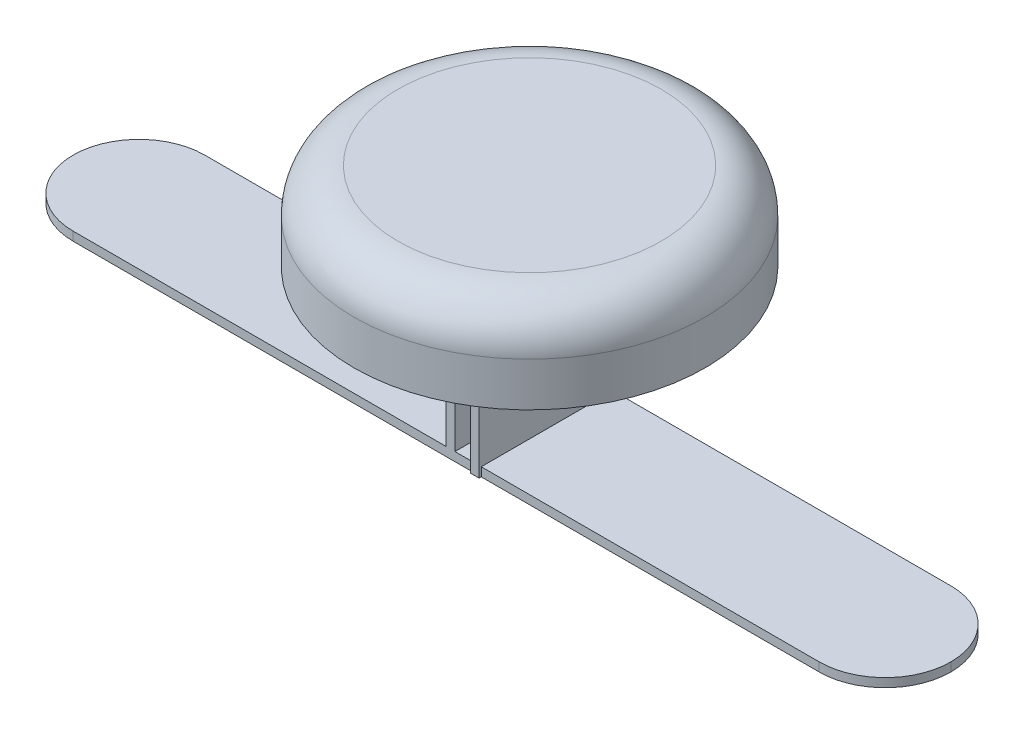
ISO-10303-21;
HEADER;
FILE_DESCRIPTION(('STEP AP214'),'2;1');
FILE_NAME('part.step','',(''),(''),'','','');
FILE_SCHEMA(('AUTOMOTIVE_DESIGN { 1 0 10303 214 1 1 1 1 }'));
ENDSEC;
DATA;
#1=APPLICATION_CONTEXT('core data for automotive mechanical design processes');
#2=APPLICATION_PROTOCOL_DEFINITION('international standard','automotive_design',2000,#1);
#3=PRODUCT_CONTEXT('',#1,'mechanical');
#4=PRODUCT('Part','Part','',(#3));
#5=PRODUCT_RELATED_PRODUCT_CATEGORY('part','',(#4));
#6=PRODUCT_DEFINITION_FORMATION('','',#4);
#7=PRODUCT_DEFINITION_CONTEXT('part definition',#1,'design');
#8=PRODUCT_DEFINITION('design','',#6,#7);
#9=PRODUCT_DEFINITION_SHAPE('','',#8);
#10=(LENGTH_UNIT() NAMED_UNIT(*) SI_UNIT(.MILLI.,.METRE.));
#11=(NAMED_UNIT(*) PLANE_ANGLE_UNIT() SI_UNIT($,.RADIAN.));
#12=(NAMED_UNIT(*) SI_UNIT($,.STERADIAN.) SOLID_ANGLE_UNIT());
#13=UNCERTAINTY_MEASURE_WITH_UNIT(LENGTH_MEASURE(1.E-05),#10,'distance_accuracy_value','');
#14=(GEOMETRIC_REPRESENTATION_CONTEXT(3) GLOBAL_UNCERTAINTY_ASSIGNED_CONTEXT((#13)) GLOBAL_UNIT_ASSIGNED_CONTEXT((#10,
#11,#12)) REPRESENTATION_CONTEXT('',''));
#15=CARTESIAN_POINT('',(0.,0.,0.));
#16=DIRECTION('',(0.,0.,1.));
#17=DIRECTION('',(1.,0.,0.));
#18=AXIS2_PLACEMENT_3D('',#15,#16,#17);
#19=CARTESIAN_POINT('',(0.,0.,0.));
#20=DIRECTION('',(0.,1.,0.));
#21=DIRECTION('',(0.,0.,1.));
#22=AXIS2_PLACEMENT_3D('',#19,#20,#21);
#23=PLANE('',#22);
#24=DIRECTION('',(0.,0.,-1.));
#25=VECTOR('',#24,1.);
#26=CARTESIAN_POINT('',(-0.4,0.,1.5));
#27=LINE('',#26,#25);
#28=CARTESIAN_POINT('',(-0.4,0.,1.5));
#29=VERTEX_POINT('',#28);
#30=CARTESIAN_POINT('',(-0.4,0.,-1.5));
#31=VERTEX_POINT('',#30);
#32=EDGE_CURVE('E217',#29,#31,#27,.T.);
#33=ORIENTED_EDGE('',*,*,#32,.F.);
#34=DIRECTION('',(-1.,0.,0.));
#35=VECTOR('',#34,1.);
#36=CARTESIAN_POINT('',(-0.4,0.,1.5));
#37=LINE('',#36,#35);
#38=CARTESIAN_POINT('',(-0.2,0.,1.5));
#39=VERTEX_POINT('',#38);
#40=EDGE_CURVE('E222',#39,#29,#37,.T.);
#41=ORIENTED_EDGE('',*,*,#40,.F.);
#42=DIRECTION('',(0.,0.,1.));
#43=VECTOR('',#42,1.);
#44=CARTESIAN_POINT('',(-0.2,0.,1.5));
#45=LINE('',#44,#43);
#46=CARTESIAN_POINT('',(-0.2,0.,-1.5));
#47=VERTEX_POINT('',#46);
#48=EDGE_CURVE('E231',#47,#39,#45,.T.);
#49=ORIENTED_EDGE('',*,*,#48,.F.);
#50=DIRECTION('',(1.,0.,0.));
#51=VECTOR('',#50,1.);
#52=CARTESIAN_POINT('',(-0.4,0.,-1.5));
#53=LINE('',#52,#51);
#54=EDGE_CURVE('E228',#31,#47,#53,.T.);
#55=ORIENTED_EDGE('',*,*,#54,.F.);
#56=EDGE_LOOP('',(#33,#41,#49,#55));
#57=FACE_BOUND('',#56,.T.);
#58=CARTESIAN_POINT('',(0.,0.,0.));
#59=DIRECTION('',(0.,1.,0.));
#60=DIRECTION('',(0.,0.,1.));
#61=AXIS2_PLACEMENT_3D('',#58,#59,#60);
#62=CIRCLE('',#61,4.);
#63=CARTESIAN_POINT('',(0.,0.,4.));
#64=VERTEX_POINT('',#63);
#65=EDGE_CURVE('E243',#64,#64,#62,.T.);
#66=ORIENTED_EDGE('',*,*,#65,.F.);
#67=EDGE_LOOP('',(#66));
#68=FACE_BOUND('',#67,.T.);
#69=DIRECTION('',(0.,0.,-1.));
#70=VECTOR('',#69,1.);
#71=CARTESIAN_POINT('',(0.2,0.,1.55));
#72=LINE('',#71,#70);
#73=CARTESIAN_POINT('',(0.2,0.,1.55));
#74=VERTEX_POINT('',#73);
#75=CARTESIAN_POINT('',(0.2,0.,-1.45));
#76=VERTEX_POINT('',#75);
#77=EDGE_CURVE('E189',#74,#76,#72,.T.);
#78=ORIENTED_EDGE('',*,*,#77,.F.);
#79=DIRECTION('',(-1.,0.,0.));
#80=VECTOR('',#79,1.);
#81=CARTESIAN_POINT('',(0.2,0.,1.55));
#82=LINE('',#81,#80);
#83=CARTESIAN_POINT('',(0.4,0.,1.55));
#84=VERTEX_POINT('',#83);
#85=EDGE_CURVE('E193',#84,#74,#82,.T.);
#86=ORIENTED_EDGE('',*,*,#85,.F.);
#87=DIRECTION('',(0.,0.,1.));
#88=VECTOR('',#87,1.);
#89=CARTESIAN_POINT('',(0.4,0.,1.55));
#90=LINE('',#89,#88);
#91=CARTESIAN_POINT('',(0.4,0.,-1.45));
#92=VERTEX_POINT('',#91);
#93=EDGE_CURVE('E203',#92,#84,#90,.T.);
#94=ORIENTED_EDGE('',*,*,#93,.F.);
#95=DIRECTION('',(1.,0.,0.));
#96=VECTOR('',#95,1.);
#97=CARTESIAN_POINT('',(0.2,0.,-1.45));
#98=LINE('',#97,#96);
#99=EDGE_CURVE('E200',#76,#92,#98,.T.);
#100=ORIENTED_EDGE('',*,*,#99,.F.);
#101=EDGE_LOOP('',(#78,#86,#94,#100));
#102=FACE_BOUND('',#101,.T.);
#103=ADVANCED_FACE('F33',(#57,#68,#102),#23,.F.);
#104=CARTESIAN_POINT('',(0.,2.,0.));
#105=DIRECTION('',(0.,-1.,0.));
#106=DIRECTION('',(0.,0.,-1.));
#107=AXIS2_PLACEMENT_3D('',#104,#105,#106);
#108=CYLINDRICAL_SURFACE('',#107,4.);
#109=CARTESIAN_POINT('',(0.,1.,0.));
#110=DIRECTION('',(0.,1.,0.));
#111=DIRECTION('',(0.,0.,1.));
#112=AXIS2_PLACEMENT_3D('',#109,#110,#111);
#113=CIRCLE('',#112,4.);
#114=CARTESIAN_POINT('',(0.,1.,4.));
#115=VERTEX_POINT('',#114);
#116=EDGE_CURVE('E165',#115,#115,#113,.F.);
#117=ORIENTED_EDGE('',*,*,#116,.T.);
#118=EDGE_LOOP('',(#117));
#119=FACE_BOUND('',#118,.T.);
#120=ORIENTED_EDGE('',*,*,#65,.T.);
#121=EDGE_LOOP('',(#120));
#122=FACE_BOUND('',#121,.T.);
#123=ADVANCED_FACE('F339',(#119,#122),#108,.T.);
#124=CARTESIAN_POINT('',(0.,2.,0.));
#125=DIRECTION('',(0.,1.,0.));
#126=DIRECTION('',(0.,0.,1.));
#127=AXIS2_PLACEMENT_3D('',#124,#125,#126);
#128=PLANE('',#127);
#129=CARTESIAN_POINT('',(0.,2.,0.));
#130=DIRECTION('',(0.,1.,0.));
#131=DIRECTION('',(0.,0.,1.));
#132=AXIS2_PLACEMENT_3D('',#129,#130,#131);
#133=CIRCLE('',#132,3.);
#134=CARTESIAN_POINT('',(0.,2.,3.));
#135=VERTEX_POINT('',#134);
#136=EDGE_CURVE('E246',#135,#135,#133,.T.);
#137=ORIENTED_EDGE('',*,*,#136,.T.);
#138=EDGE_LOOP('',(#137));
#139=FACE_BOUND('',#138,.T.);
#140=ADVANCED_FACE('F344',(#139),#128,.T.);
#141=CARTESIAN_POINT('',(0.,1.,0.));
#142=DIRECTION('',(0.,1.,0.));
#143=DIRECTION('',(0.,0.,1.));
#144=AXIS2_PLACEMENT_3D('',#141,#142,#143);
#145=TOROIDAL_SURFACE('',#144,3.,1.);
#146=ORIENTED_EDGE('',*,*,#116,.F.);
#147=EDGE_LOOP('',(#146));
#148=FACE_BOUND('',#147,.T.);
#149=ORIENTED_EDGE('',*,*,#136,.F.);
#150=EDGE_LOOP('',(#149));
#151=FACE_BOUND('',#150,.T.);
#152=ADVANCED_FACE('F350',(#148,#151),#145,.T.);
#153=CARTESIAN_POINT('',(-0.4,-3.2,1.5));
#154=DIRECTION('',(1.,0.,0.));
#155=DIRECTION('',(0.,0.,-1.));
#156=AXIS2_PLACEMENT_3D('',#153,#154,#155);
#157=PLANE('',#156);
#158=DIRECTION('',(0.,1.,0.));
#159=VECTOR('',#158,1.);
#160=CARTESIAN_POINT('',(-0.4,-3.2,-1.5));
#161=LINE('',#160,#159);
#162=CARTESIAN_POINT('',(-0.399999999999999,-3.,-1.5));
#163=VERTEX_POINT('',#162);
#164=EDGE_CURVE('E241',#163,#31,#161,.T.);
#165=ORIENTED_EDGE('',*,*,#164,.F.);
#166=DIRECTION('',(0.,0.,1.));
#167=VECTOR('',#166,1.);
#168=CARTESIAN_POINT('',(-0.4,-3.,1.5));
#169=LINE('',#168,#167);
#170=CARTESIAN_POINT('',(-0.4,-3.,1.5));
#171=VERTEX_POINT('',#170);
#172=EDGE_CURVE('E186',#163,#171,#169,.T.);
#173=ORIENTED_EDGE('',*,*,#172,.T.);
#174=DIRECTION('',(0.,1.,0.));
#175=VECTOR('',#174,1.);
#176=CARTESIAN_POINT('',(-0.4,-3.2,1.5));
#177=LINE('',#176,#175);
#178=EDGE_CURVE('E225',#171,#29,#177,.T.);
#179=ORIENTED_EDGE('',*,*,#178,.T.);
#180=ORIENTED_EDGE('',*,*,#32,.T.);
#181=EDGE_LOOP('',(#165,#173,#179,#180));
#182=FACE_BOUND('',#181,.T.);
#183=ADVANCED_FACE('F305',(#182),#157,.F.);
#184=CARTESIAN_POINT('',(-0.4,-3.2,-1.5));
#185=DIRECTION('',(0.,0.,1.));
#186=DIRECTION('',(1.,0.,0.));
#187=AXIS2_PLACEMENT_3D('',#184,#185,#186);
#188=PLANE('',#187);
#189=DIRECTION('',(1.,0.,0.));
#190=VECTOR('',#189,1.);
#191=CARTESIAN_POINT('',(-0.4,-3.2,-1.5));
#192=LINE('',#191,#190);
#193=CARTESIAN_POINT('',(-8.9,-3.2,-1.5));
#194=VERTEX_POINT('',#193);
#195=CARTESIAN_POINT('',(8.1,-3.2,-1.5));
#196=VERTEX_POINT('',#195);
#197=EDGE_CURVE('E218',#194,#196,#192,.T.);
#198=ORIENTED_EDGE('',*,*,#197,.F.);
#199=DIRECTION('',(0.,-1.,0.));
#200=VECTOR('',#199,1.);
#201=CARTESIAN_POINT('',(-8.9,-3.2,-1.5));
#202=LINE('',#201,#200);
#203=CARTESIAN_POINT('',(-8.9,-3.,-1.5));
#204=VERTEX_POINT('',#203);
#205=EDGE_CURVE('E267',#194,#204,#202,.F.);
#206=ORIENTED_EDGE('',*,*,#205,.T.);
#207=DIRECTION('',(-1.,0.,0.));
#208=VECTOR('',#207,1.);
#209=CARTESIAN_POINT('',(9.6,-3.,-1.5));
#210=LINE('',#209,#208);
#211=EDGE_CURVE('E153',#163,#204,#210,.T.);
#212=ORIENTED_EDGE('',*,*,#211,.F.);
#213=ORIENTED_EDGE('',*,*,#164,.T.);
#214=ORIENTED_EDGE('',*,*,#54,.T.);
#215=DIRECTION('',(0.,1.,0.));
#216=VECTOR('',#215,1.);
#217=CARTESIAN_POINT('',(-0.2,-3.2,-1.5));
#218=LINE('',#217,#216);
#219=CARTESIAN_POINT('',(-0.2,-3.,-1.5));
#220=VERTEX_POINT('',#219);
#221=EDGE_CURVE('E239',#220,#47,#218,.T.);
#222=ORIENTED_EDGE('',*,*,#221,.F.);
#223=CARTESIAN_POINT('',(8.1,-3.,-1.5));
#224=VERTEX_POINT('',#223);
#225=EDGE_CURVE('E175',#224,#220,#210,.T.);
#226=ORIENTED_EDGE('',*,*,#225,.F.);
#227=DIRECTION('',(0.,-1.,0.));
#228=VECTOR('',#227,1.);
#229=CARTESIAN_POINT('',(8.1,-3.2,-1.5));
#230=LINE('',#229,#228);
#231=EDGE_CURVE('E265',#224,#196,#230,.T.);
#232=ORIENTED_EDGE('',*,*,#231,.T.);
#233=EDGE_LOOP('',(#198,#206,#212,#213,#214,#222,#226,#232));
#234=FACE_BOUND('',#233,.T.);
#235=ADVANCED_FACE('F286',(#234),#188,.F.);
#236=CARTESIAN_POINT('',(-0.2,-3.2,1.5));
#237=DIRECTION('',(-1.,0.,0.));
#238=DIRECTION('',(0.,0.,1.));
#239=AXIS2_PLACEMENT_3D('',#236,#237,#238);
#240=PLANE('',#239);
#241=DIRECTION('',(0.,1.,0.));
#242=VECTOR('',#241,1.);
#243=CARTESIAN_POINT('',(-0.2,-3.2,1.5));
#244=LINE('',#243,#242);
#245=CARTESIAN_POINT('',(-0.200000000000001,-3.,1.5));
#246=VERTEX_POINT('',#245);
#247=EDGE_CURVE('E237',#246,#39,#244,.T.);
#248=ORIENTED_EDGE('',*,*,#247,.F.);
#249=DIRECTION('',(0.,0.,-1.));
#250=VECTOR('',#249,1.);
#251=CARTESIAN_POINT('',(-0.2,-3.,1.5));
#252=LINE('',#251,#250);
#253=EDGE_CURVE('E183',#246,#220,#252,.T.);
#254=ORIENTED_EDGE('',*,*,#253,.T.);
#255=ORIENTED_EDGE('',*,*,#221,.T.);
#256=ORIENTED_EDGE('',*,*,#48,.T.);
#257=EDGE_LOOP('',(#248,#254,#255,#256));
#258=FACE_BOUND('',#257,.T.);
#259=ADVANCED_FACE('F312',(#258),#240,.F.);
#260=CARTESIAN_POINT('',(-0.4,-3.2,1.5));
#261=DIRECTION('',(0.,0.,-1.));
#262=DIRECTION('',(-1.,0.,0.));
#263=AXIS2_PLACEMENT_3D('',#260,#261,#262);
#264=PLANE('',#263);
#265=DIRECTION('',(-1.,0.,0.));
#266=VECTOR('',#265,1.);
#267=CARTESIAN_POINT('',(9.6,-3.,1.5));
#268=LINE('',#267,#266);
#269=CARTESIAN_POINT('',(-8.9,-3.,1.5));
#270=VERTEX_POINT('',#269);
#271=EDGE_CURVE('E156',#171,#270,#268,.T.);
#272=ORIENTED_EDGE('',*,*,#271,.T.);
#273=DIRECTION('',(0.,1.,0.));
#274=VECTOR('',#273,1.);
#275=CARTESIAN_POINT('',(-8.9,-3.2,1.5));
#276=LINE('',#275,#274);
#277=CARTESIAN_POINT('',(-8.9,-3.2,1.5));
#278=VERTEX_POINT('',#277);
#279=EDGE_CURVE('E254',#270,#278,#276,.F.);
#280=ORIENTED_EDGE('',*,*,#279,.T.);
#281=DIRECTION('',(-1.,0.,0.));
#282=VECTOR('',#281,1.);
#283=CARTESIAN_POINT('',(-0.4,-3.2,1.5));
#284=LINE('',#283,#282);
#285=CARTESIAN_POINT('',(0.200000000000001,-3.2,1.5));
#286=VERTEX_POINT('',#285);
#287=EDGE_CURVE('E221',#286,#278,#284,.T.);
#288=ORIENTED_EDGE('',*,*,#287,.F.);
#289=DIRECTION('',(0.,-1.,0.));
#290=VECTOR('',#289,1.);
#291=CARTESIAN_POINT('',(0.2,-3.2,1.5));
#292=LINE('',#291,#290);
#293=CARTESIAN_POINT('',(0.200000000000001,-3.,1.5));
#294=VERTEX_POINT('',#293);
#295=EDGE_CURVE('E170',#294,#286,#292,.T.);
#296=ORIENTED_EDGE('',*,*,#295,.F.);
#297=EDGE_CURVE('E154',#294,#246,#268,.T.);
#298=ORIENTED_EDGE('',*,*,#297,.T.);
#299=ORIENTED_EDGE('',*,*,#247,.T.);
#300=ORIENTED_EDGE('',*,*,#40,.T.);
#301=ORIENTED_EDGE('',*,*,#178,.F.);
#302=EDGE_LOOP('',(#272,#280,#288,#296,#298,#299,#300,#301));
#303=FACE_BOUND('',#302,.T.);
#304=ADVANCED_FACE('F301',(#303),#264,.F.);
#305=CARTESIAN_POINT('',(0.,-3.2,0.));
#306=DIRECTION('',(0.,-1.,0.));
#307=DIRECTION('',(0.,0.,-1.));
#308=AXIS2_PLACEMENT_3D('',#305,#306,#307);
#309=PLANE('',#308);
#310=ORIENTED_EDGE('',*,*,#287,.T.);
#311=CARTESIAN_POINT('',(-8.9,-3.2,0.));
#312=DIRECTION('',(0.,-1.,0.));
#313=DIRECTION('',(0.,0.,-1.));
#314=AXIS2_PLACEMENT_3D('',#311,#312,#313);
#315=CIRCLE('',#314,1.5);
#316=CARTESIAN_POINT('',(-10.4,-3.2,0.));
#317=VERTEX_POINT('',#316);
#318=EDGE_CURVE('E263',#278,#317,#315,.T.);
#319=ORIENTED_EDGE('',*,*,#318,.T.);
#320=CARTESIAN_POINT('',(-8.9,-3.2,0.));
#321=DIRECTION('',(0.,-1.,0.));
#322=DIRECTION('',(0.,0.,-1.));
#323=AXIS2_PLACEMENT_3D('',#320,#321,#322);
#324=CIRCLE('',#323,1.5);
#325=EDGE_CURVE('E261',#317,#194,#324,.T.);
#326=ORIENTED_EDGE('',*,*,#325,.T.);
#327=ORIENTED_EDGE('',*,*,#197,.T.);
#328=CARTESIAN_POINT('',(8.1,-3.2,0.));
#329=DIRECTION('',(0.,-1.,0.));
#330=DIRECTION('',(0.,0.,-1.));
#331=AXIS2_PLACEMENT_3D('',#328,#329,#330);
#332=CIRCLE('',#331,1.5);
#333=CARTESIAN_POINT('',(9.6,-3.2,0.));
#334=VERTEX_POINT('',#333);
#335=EDGE_CURVE('E257',#196,#334,#332,.T.);
#336=ORIENTED_EDGE('',*,*,#335,.T.);
#337=CARTESIAN_POINT('',(8.1,-3.2,0.));
#338=DIRECTION('',(0.,-1.,0.));
#339=DIRECTION('',(0.,0.,-1.));
#340=AXIS2_PLACEMENT_3D('',#337,#338,#339);
#341=CIRCLE('',#340,1.5);
#342=CARTESIAN_POINT('',(8.1,-3.2,1.5));
#343=VERTEX_POINT('',#342);
#344=EDGE_CURVE('E259',#334,#343,#341,.T.);
#345=ORIENTED_EDGE('',*,*,#344,.T.);
#346=DIRECTION('',(-1.,0.,0.));
#347=VECTOR('',#346,1.);
#348=CARTESIAN_POINT('',(9.6,-3.2,1.5));
#349=LINE('',#348,#347);
#350=CARTESIAN_POINT('',(0.400000000000001,-3.2,1.5));
#351=VERTEX_POINT('',#350);
#352=EDGE_CURVE('E171',#343,#351,#349,.T.);
#353=ORIENTED_EDGE('',*,*,#352,.T.);
#354=DIRECTION('',(0.,0.,1.));
#355=VECTOR('',#354,1.);
#356=CARTESIAN_POINT('',(0.4,-3.2,1.55));
#357=LINE('',#356,#355);
#358=CARTESIAN_POINT('',(0.4,-3.2,1.55));
#359=VERTEX_POINT('',#358);
#360=EDGE_CURVE('E169',#351,#359,#357,.T.);
#361=ORIENTED_EDGE('',*,*,#360,.T.);
#362=DIRECTION('',(-1.,0.,0.));
#363=VECTOR('',#362,1.);
#364=CARTESIAN_POINT('',(0.2,-3.2,1.55));
#365=LINE('',#364,#363);
#366=CARTESIAN_POINT('',(0.2,-3.2,1.55));
#367=VERTEX_POINT('',#366);
#368=EDGE_CURVE('E195',#359,#367,#365,.T.);
#369=ORIENTED_EDGE('',*,*,#368,.T.);
#370=DIRECTION('',(0.,0.,-1.));
#371=VECTOR('',#370,1.);
#372=CARTESIAN_POINT('',(0.2,-3.2,1.55));
#373=LINE('',#372,#371);
#374=EDGE_CURVE('E190',#367,#286,#373,.T.);
#375=ORIENTED_EDGE('',*,*,#374,.T.);
#376=EDGE_LOOP('',(#310,#319,#326,#327,#336,#345,#353,#361,#369,#375));
#377=FACE_BOUND('',#376,.T.);
#378=ADVANCED_FACE('F320',(#377),#309,.T.);
#379=CARTESIAN_POINT('',(0.2,-3.2,1.55));
#380=DIRECTION('',(1.,0.,0.));
#381=DIRECTION('',(0.,0.,-1.));
#382=AXIS2_PLACEMENT_3D('',#379,#380,#381);
#383=PLANE('',#382);
#384=DIRECTION('',(0.,0.,1.));
#385=VECTOR('',#384,1.);
#386=CARTESIAN_POINT('',(0.2,-3.,1.55));
#387=LINE('',#386,#385);
#388=CARTESIAN_POINT('',(0.2,-3.,-1.45));
#389=VERTEX_POINT('',#388);
#390=EDGE_CURVE('E180',#389,#294,#387,.T.);
#391=ORIENTED_EDGE('',*,*,#390,.T.);
#392=ORIENTED_EDGE('',*,*,#295,.T.);
#393=ORIENTED_EDGE('',*,*,#374,.F.);
#394=DIRECTION('',(0.,1.,0.));
#395=VECTOR('',#394,1.);
#396=CARTESIAN_POINT('',(0.2,-3.2,1.55));
#397=LINE('',#396,#395);
#398=EDGE_CURVE('E197',#367,#74,#397,.T.);
#399=ORIENTED_EDGE('',*,*,#398,.T.);
#400=ORIENTED_EDGE('',*,*,#77,.T.);
#401=DIRECTION('',(0.,1.,0.));
#402=VECTOR('',#401,1.);
#403=CARTESIAN_POINT('',(0.2,-3.2,-1.45));
#404=LINE('',#403,#402);
#405=EDGE_CURVE('E215',#389,#76,#404,.T.);
#406=ORIENTED_EDGE('',*,*,#405,.F.);
#407=EDGE_LOOP('',(#391,#392,#393,#399,#400,#406));
#408=FACE_BOUND('',#407,.T.);
#409=ADVANCED_FACE('F317',(#408),#383,.F.);
#410=CARTESIAN_POINT('',(0.2,-3.2,-1.45));
#411=DIRECTION('',(0.,0.,1.));
#412=DIRECTION('',(1.,0.,0.));
#413=AXIS2_PLACEMENT_3D('',#410,#411,#412);
#414=PLANE('',#413);
#415=DIRECTION('',(0.,1.,0.));
#416=VECTOR('',#415,1.);
#417=CARTESIAN_POINT('',(0.4,-3.2,-1.45));
#418=LINE('',#417,#416);
#419=CARTESIAN_POINT('',(0.4,-3.,-1.45));
#420=VERTEX_POINT('',#419);
#421=EDGE_CURVE('E213',#420,#92,#418,.T.);
#422=ORIENTED_EDGE('',*,*,#421,.F.);
#423=DIRECTION('',(-1.,0.,0.));
#424=VECTOR('',#423,1.);
#425=CARTESIAN_POINT('',(0.2,-3.,-1.45));
#426=LINE('',#425,#424);
#427=EDGE_CURVE('E161',#420,#389,#426,.T.);
#428=ORIENTED_EDGE('',*,*,#427,.T.);
#429=ORIENTED_EDGE('',*,*,#405,.T.);
#430=ORIENTED_EDGE('',*,*,#99,.T.);
#431=EDGE_LOOP('',(#422,#428,#429,#430));
#432=FACE_BOUND('',#431,.T.);
#433=ADVANCED_FACE('F329',(#432),#414,.F.);
#434=CARTESIAN_POINT('',(0.4,-3.2,1.55));
#435=DIRECTION('',(-1.,0.,0.));
#436=DIRECTION('',(0.,0.,1.));
#437=AXIS2_PLACEMENT_3D('',#434,#435,#436);
#438=PLANE('',#437);
#439=ORIENTED_EDGE('',*,*,#360,.F.);
#440=DIRECTION('',(0.,1.,0.));
#441=VECTOR('',#440,1.);
#442=CARTESIAN_POINT('',(0.4,-3.2,1.5));
#443=LINE('',#442,#441);
#444=CARTESIAN_POINT('',(0.399999999999999,-3.,1.5));
#445=VERTEX_POINT('',#444);
#446=EDGE_CURVE('E150',#351,#445,#443,.T.);
#447=ORIENTED_EDGE('',*,*,#446,.T.);
#448=DIRECTION('',(0.,0.,-1.));
#449=VECTOR('',#448,1.);
#450=CARTESIAN_POINT('',(0.4,-3.,1.55));
#451=LINE('',#450,#449);
#452=EDGE_CURVE('E158',#445,#420,#451,.T.);
#453=ORIENTED_EDGE('',*,*,#452,.T.);
#454=ORIENTED_EDGE('',*,*,#421,.T.);
#455=ORIENTED_EDGE('',*,*,#93,.T.);
#456=DIRECTION('',(0.,1.,0.));
#457=VECTOR('',#456,1.);
#458=CARTESIAN_POINT('',(0.4,-3.2,1.55));
#459=LINE('',#458,#457);
#460=EDGE_CURVE('E210',#359,#84,#459,.T.);
#461=ORIENTED_EDGE('',*,*,#460,.F.);
#462=EDGE_LOOP('',(#439,#447,#453,#454,#455,#461));
#463=FACE_BOUND('',#462,.T.);
#464=ADVANCED_FACE('F167',(#463),#438,.F.);
#465=CARTESIAN_POINT('',(0.2,-3.2,1.55));
#466=DIRECTION('',(0.,0.,-1.));
#467=DIRECTION('',(-1.,0.,0.));
#468=AXIS2_PLACEMENT_3D('',#465,#466,#467);
#469=PLANE('',#468);
#470=ORIENTED_EDGE('',*,*,#85,.T.);
#471=ORIENTED_EDGE('',*,*,#398,.F.);
#472=ORIENTED_EDGE('',*,*,#368,.F.);
#473=ORIENTED_EDGE('',*,*,#460,.T.);
#474=EDGE_LOOP('',(#470,#471,#472,#473));
#475=FACE_BOUND('',#474,.T.);
#476=ADVANCED_FACE('F324',(#475),#469,.F.);
#477=CARTESIAN_POINT('',(9.6,-3.,1.5));
#478=DIRECTION('',(0.,1.,0.));
#479=DIRECTION('',(0.,0.,1.));
#480=AXIS2_PLACEMENT_3D('',#477,#478,#479);
#481=PLANE('',#480);
#482=CARTESIAN_POINT('',(8.1,-3.,1.5));
#483=VERTEX_POINT('',#482);
#484=EDGE_CURVE('E145',#483,#445,#268,.T.);
#485=ORIENTED_EDGE('',*,*,#484,.F.);
#486=CARTESIAN_POINT('',(8.1,-3.,0.));
#487=DIRECTION('',(0.,1.,0.));
#488=DIRECTION('',(0.,0.,1.));
#489=AXIS2_PLACEMENT_3D('',#486,#487,#488);
#490=CIRCLE('',#489,1.5);
#491=CARTESIAN_POINT('',(9.6,-3.,0.));
#492=VERTEX_POINT('',#491);
#493=EDGE_CURVE('E11',#483,#492,#490,.T.);
#494=ORIENTED_EDGE('',*,*,#493,.T.);
#495=CARTESIAN_POINT('',(8.1,-3.,0.));
#496=DIRECTION('',(0.,1.,0.));
#497=DIRECTION('',(0.,0.,1.));
#498=AXIS2_PLACEMENT_3D('',#495,#496,#497);
#499=CIRCLE('',#498,1.5);
#500=EDGE_CURVE('E42',#492,#224,#499,.T.);
#501=ORIENTED_EDGE('',*,*,#500,.T.);
#502=ORIENTED_EDGE('',*,*,#225,.T.);
#503=ORIENTED_EDGE('',*,*,#253,.F.);
#504=ORIENTED_EDGE('',*,*,#297,.F.);
#505=ORIENTED_EDGE('',*,*,#390,.F.);
#506=ORIENTED_EDGE('',*,*,#427,.F.);
#507=ORIENTED_EDGE('',*,*,#452,.F.);
#508=EDGE_LOOP('',(#485,#494,#501,#502,#503,#504,#505,#506,#507));
#509=FACE_BOUND('',#508,.T.);
#510=ADVANCED_FACE('F159',(#509),#481,.T.);
#511=CARTESIAN_POINT('',(9.6,-3.,1.5));
#512=DIRECTION('',(0.,0.,1.));
#513=DIRECTION('',(0.,-1.,0.));
#514=AXIS2_PLACEMENT_3D('',#511,#512,#513);
#515=PLANE('',#514);
#516=ORIENTED_EDGE('',*,*,#352,.F.);
#517=DIRECTION('',(0.,1.,0.));
#518=VECTOR('',#517,1.);
#519=CARTESIAN_POINT('',(8.1,-3.,1.5));
#520=LINE('',#519,#518);
#521=EDGE_CURVE('E152',#343,#483,#520,.T.);
#522=ORIENTED_EDGE('',*,*,#521,.T.);
#523=ORIENTED_EDGE('',*,*,#484,.T.);
#524=ORIENTED_EDGE('',*,*,#446,.F.);
#525=EDGE_LOOP('',(#516,#522,#523,#524));
#526=FACE_BOUND('',#525,.T.);
#527=ADVANCED_FACE('F148',(#526),#515,.T.);
#528=CARTESIAN_POINT('',(-8.9,-3.,0.));
#529=DIRECTION('',(0.,1.,0.));
#530=DIRECTION('',(0.,0.,1.));
#531=AXIS2_PLACEMENT_3D('',#528,#529,#530);
#532=CIRCLE('',#531,1.5);
#533=CARTESIAN_POINT('',(-10.4,-3.,0.));
#534=VERTEX_POINT('',#533);
#535=EDGE_CURVE('E164',#204,#534,#532,.T.);
#536=ORIENTED_EDGE('',*,*,#535,.T.);
#537=CARTESIAN_POINT('',(-8.9,-3.,0.));
#538=DIRECTION('',(0.,1.,0.));
#539=DIRECTION('',(0.,0.,1.));
#540=AXIS2_PLACEMENT_3D('',#537,#538,#539);
#541=CIRCLE('',#540,1.5);
#542=EDGE_CURVE('E252',#534,#270,#541,.T.);
#543=ORIENTED_EDGE('',*,*,#542,.T.);
#544=ORIENTED_EDGE('',*,*,#271,.F.);
#545=ORIENTED_EDGE('',*,*,#172,.F.);
#546=ORIENTED_EDGE('',*,*,#211,.T.);
#547=EDGE_LOOP('',(#536,#543,#544,#545,#546));
#548=FACE_BOUND('',#547,.T.);
#549=ADVANCED_FACE('F291',(#548),#481,.T.);
#550=CARTESIAN_POINT('',(-8.9,0.,0.));
#551=DIRECTION('',(0.,-1.,0.));
#552=DIRECTION('',(1.,0.,0.));
#553=AXIS2_PLACEMENT_3D('',#550,#551,#552);
#554=CYLINDRICAL_SURFACE('',#553,1.5);
#555=ORIENTED_EDGE('',*,*,#205,.F.);
#556=ORIENTED_EDGE('',*,*,#325,.F.);
#557=DIRECTION('',(0.,-1.,0.));
#558=VECTOR('',#557,1.);
#559=CARTESIAN_POINT('',(-10.4,0.,0.));
#560=LINE('',#559,#558);
#561=EDGE_CURVE('E270',#534,#317,#560,.T.);
#562=ORIENTED_EDGE('',*,*,#561,.F.);
#563=ORIENTED_EDGE('',*,*,#535,.F.);
#564=EDGE_LOOP('',(#555,#556,#562,#563));
#565=FACE_BOUND('',#564,.T.);
#566=ADVANCED_FACE('F295',(#565),#554,.T.);
#567=CARTESIAN_POINT('',(-8.9,0.,0.));
#568=DIRECTION('',(0.,1.,0.));
#569=DIRECTION('',(-1.,0.,0.));
#570=AXIS2_PLACEMENT_3D('',#567,#568,#569);
#571=CYLINDRICAL_SURFACE('',#570,1.5);
#572=ORIENTED_EDGE('',*,*,#318,.F.);
#573=ORIENTED_EDGE('',*,*,#279,.F.);
#574=ORIENTED_EDGE('',*,*,#542,.F.);
#575=ORIENTED_EDGE('',*,*,#561,.T.);
#576=EDGE_LOOP('',(#572,#573,#574,#575));
#577=FACE_BOUND('',#576,.T.);
#578=ADVANCED_FACE('F298',(#577),#571,.T.);
#579=CARTESIAN_POINT('',(8.1,-3.2,0.));
#580=DIRECTION('',(0.,1.,0.));
#581=DIRECTION('',(-1.,0.,0.));
#582=AXIS2_PLACEMENT_3D('',#579,#580,#581);
#583=CYLINDRICAL_SURFACE('',#582,1.5);
#584=DIRECTION('',(0.,-1.,0.));
#585=VECTOR('',#584,1.);
#586=CARTESIAN_POINT('',(9.6,-3.,0.));
#587=LINE('',#586,#585);
#588=EDGE_CURVE('E37',#334,#492,#587,.F.);
#589=ORIENTED_EDGE('',*,*,#588,.F.);
#590=ORIENTED_EDGE('',*,*,#335,.F.);
#591=ORIENTED_EDGE('',*,*,#231,.F.);
#592=ORIENTED_EDGE('',*,*,#500,.F.);
#593=EDGE_LOOP('',(#589,#590,#591,#592));
#594=FACE_BOUND('',#593,.T.);
#595=ADVANCED_FACE('F35',(#594),#583,.T.);
#596=CARTESIAN_POINT('',(8.1,-3.,0.));
#597=DIRECTION('',(0.,1.,0.));
#598=DIRECTION('',(0.,0.,1.));
#599=AXIS2_PLACEMENT_3D('',#596,#597,#598);
#600=CYLINDRICAL_SURFACE('',#599,1.5);
#601=ORIENTED_EDGE('',*,*,#344,.F.);
#602=ORIENTED_EDGE('',*,*,#588,.T.);
#603=ORIENTED_EDGE('',*,*,#493,.F.);
#604=ORIENTED_EDGE('',*,*,#521,.F.);
#605=EDGE_LOOP('',(#601,#602,#603,#604));
#606=FACE_BOUND('',#605,.T.);
#607=ADVANCED_FACE('F278',(#606),#600,.T.);
#608=CLOSED_SHELL('',(#103,#123,#140,#152,#183,#235,#259,#304,#378,#409,#433,#464,#476,#510,
#527,#549,#566,#578,#595,#607));
#609=MANIFOLD_SOLID_BREP('B2',#608);
#610=ADVANCED_BREP_SHAPE_REPRESENTATION('',(#18,#609),#14);
#611=SHAPE_DEFINITION_REPRESENTATION(#9,#610);
ENDSEC;
END-ISO-10303-21;
